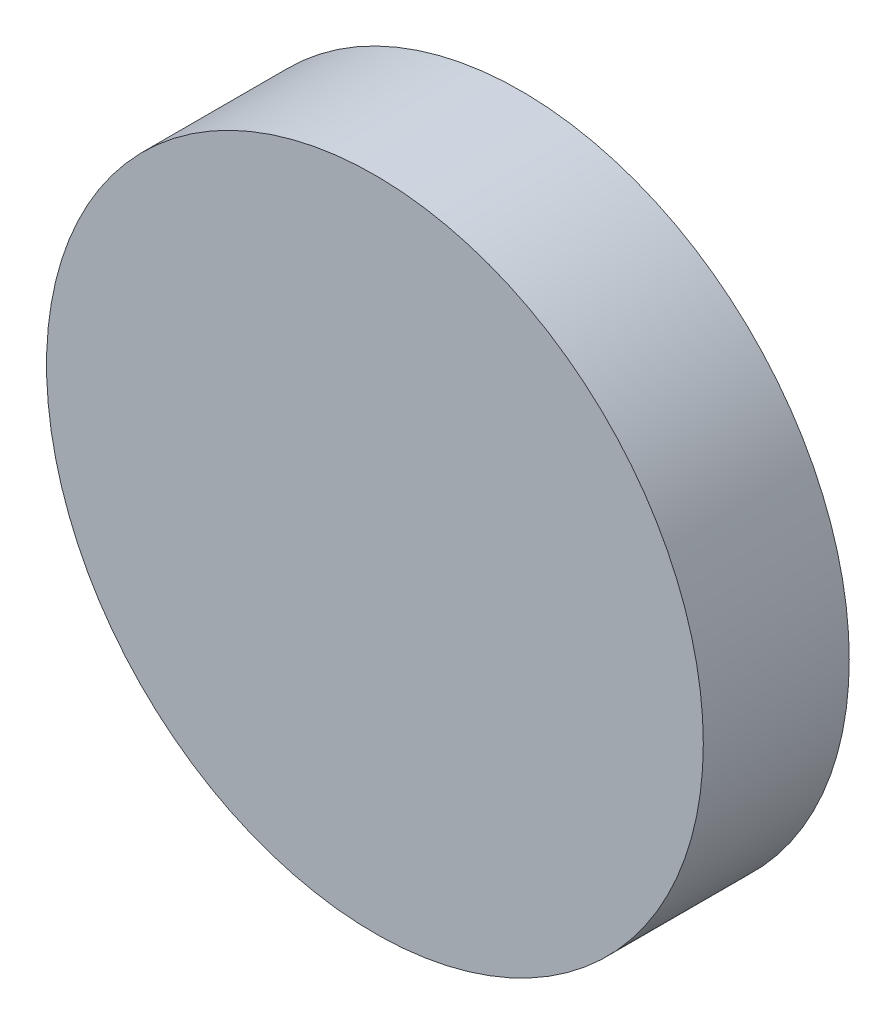
ISO-10303-21;
HEADER;
FILE_DESCRIPTION(('STEP AP214'),'2;1');
FILE_NAME('part.step','',(''),(''),'','','');
FILE_SCHEMA(('AUTOMOTIVE_DESIGN { 1 0 10303 214 1 1 1 1 }'));
ENDSEC;
DATA;
#1=APPLICATION_CONTEXT('core data for automotive mechanical design processes');
#2=APPLICATION_PROTOCOL_DEFINITION('international standard','automotive_design',2000,#1);
#3=PRODUCT_CONTEXT('',#1,'mechanical');
#4=PRODUCT('Part','Part','',(#3));
#5=PRODUCT_RELATED_PRODUCT_CATEGORY('part','',(#4));
#6=PRODUCT_DEFINITION_FORMATION('','',#4);
#7=PRODUCT_DEFINITION_CONTEXT('part definition',#1,'design');
#8=PRODUCT_DEFINITION('design','',#6,#7);
#9=PRODUCT_DEFINITION_SHAPE('','',#8);
#10=(LENGTH_UNIT() NAMED_UNIT(*) SI_UNIT(.MILLI.,.METRE.));
#11=(NAMED_UNIT(*) PLANE_ANGLE_UNIT() SI_UNIT($,.RADIAN.));
#12=(NAMED_UNIT(*) SI_UNIT($,.STERADIAN.) SOLID_ANGLE_UNIT());
#13=UNCERTAINTY_MEASURE_WITH_UNIT(LENGTH_MEASURE(1.E-05),#10,'distance_accuracy_value','');
#14=(GEOMETRIC_REPRESENTATION_CONTEXT(3) GLOBAL_UNCERTAINTY_ASSIGNED_CONTEXT((#13)) GLOBAL_UNIT_ASSIGNED_CONTEXT((#10,
#11,#12)) REPRESENTATION_CONTEXT('',''));
#15=CARTESIAN_POINT('',(0.,0.,0.));
#16=DIRECTION('',(0.,0.,1.));
#17=DIRECTION('',(1.,0.,0.));
#18=AXIS2_PLACEMENT_3D('',#15,#16,#17);
#19=CARTESIAN_POINT('',(700.,550.,-790.));
#20=DIRECTION('',(0.,0.,1.));
#21=DIRECTION('',(1.,0.,0.));
#22=AXIS2_PLACEMENT_3D('',#19,#20,#21);
#23=CYLINDRICAL_SURFACE('',#22,90.);
#24=CARTESIAN_POINT('',(700.,550.,-790.));
#25=DIRECTION('',(0.,0.,1.));
#26=DIRECTION('',(1.,0.,0.));
#27=AXIS2_PLACEMENT_3D('',#24,#25,#26);
#28=CIRCLE('',#27,90.);
#29=CARTESIAN_POINT('',(790.,550.,-790.));
#30=VERTEX_POINT('',#29);
#31=EDGE_CURVE('E10',#30,#30,#28,.T.);
#32=ORIENTED_EDGE('',*,*,#31,.T.);
#33=EDGE_LOOP('',(#32));
#34=FACE_BOUND('',#33,.T.);
#35=CARTESIAN_POINT('',(700.,550.,-750.));
#36=DIRECTION('',(0.,0.,1.));
#37=DIRECTION('',(1.,0.,0.));
#38=AXIS2_PLACEMENT_3D('',#35,#36,#37);
#39=CIRCLE('',#38,90.);
#40=CARTESIAN_POINT('',(790.,550.,-750.));
#41=VERTEX_POINT('',#40);
#42=EDGE_CURVE('E40',#41,#41,#39,.T.);
#43=ORIENTED_EDGE('',*,*,#42,.F.);
#44=EDGE_LOOP('',(#43));
#45=FACE_BOUND('',#44,.T.);
#46=ADVANCED_FACE('F37',(#34,#45),#23,.T.);
#47=CARTESIAN_POINT('',(700.,550.,-790.));
#48=DIRECTION('',(0.,0.,1.));
#49=DIRECTION('',(1.,0.,0.));
#50=AXIS2_PLACEMENT_3D('',#47,#48,#49);
#51=PLANE('',#50);
#52=ORIENTED_EDGE('',*,*,#31,.F.);
#53=EDGE_LOOP('',(#52));
#54=FACE_BOUND('',#53,.T.);
#55=ADVANCED_FACE('F52',(#54),#51,.F.);
#56=CARTESIAN_POINT('',(700.,550.,-750.));
#57=DIRECTION('',(0.,0.,1.));
#58=DIRECTION('',(1.,0.,0.));
#59=AXIS2_PLACEMENT_3D('',#56,#57,#58);
#60=PLANE('',#59);
#61=ORIENTED_EDGE('',*,*,#42,.T.);
#62=EDGE_LOOP('',(#61));
#63=FACE_BOUND('',#62,.T.);
#64=ADVANCED_FACE('F49',(#63),#60,.T.);
#65=CLOSED_SHELL('',(#46,#55,#64));
#66=MANIFOLD_SOLID_BREP('B2',#65);
#67=ADVANCED_BREP_SHAPE_REPRESENTATION('',(#18,#66),#14);
#68=SHAPE_DEFINITION_REPRESENTATION(#9,#67);
ENDSEC;
END-ISO-10303-21;
